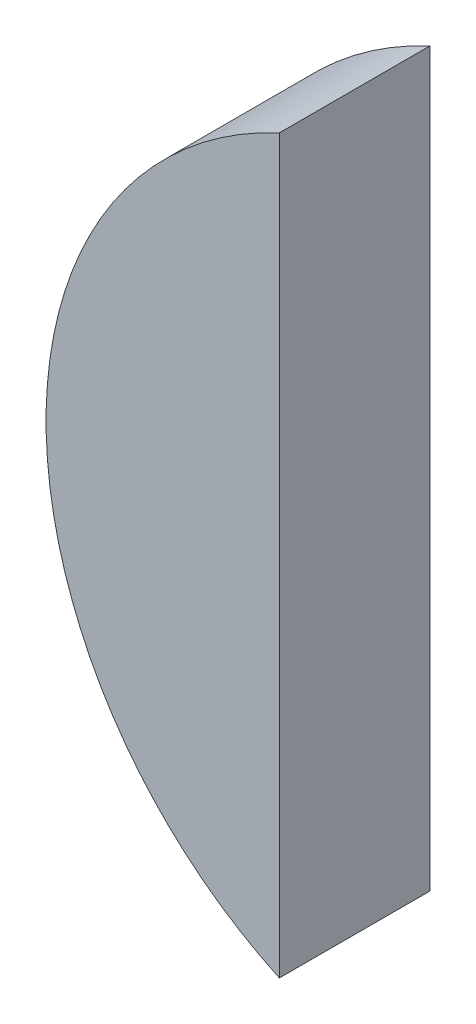
ISO-10303-21;
HEADER;
FILE_DESCRIPTION(('STEP AP214'),'2;1');
FILE_NAME('part.step','',(''),(''),'','','');
FILE_SCHEMA(('AUTOMOTIVE_DESIGN { 1 0 10303 214 1 1 1 1 }'));
ENDSEC;
DATA;
#1=APPLICATION_CONTEXT('core data for automotive mechanical design processes');
#2=APPLICATION_PROTOCOL_DEFINITION('international standard','automotive_design',2000,#1);
#3=PRODUCT_CONTEXT('',#1,'mechanical');
#4=PRODUCT('Part','Part','',(#3));
#5=PRODUCT_RELATED_PRODUCT_CATEGORY('part','',(#4));
#6=PRODUCT_DEFINITION_FORMATION('','',#4);
#7=PRODUCT_DEFINITION_CONTEXT('part definition',#1,'design');
#8=PRODUCT_DEFINITION('design','',#6,#7);
#9=PRODUCT_DEFINITION_SHAPE('','',#8);
#10=(LENGTH_UNIT() NAMED_UNIT(*) SI_UNIT(.MILLI.,.METRE.));
#11=(NAMED_UNIT(*) PLANE_ANGLE_UNIT() SI_UNIT($,.RADIAN.));
#12=(NAMED_UNIT(*) SI_UNIT($,.STERADIAN.) SOLID_ANGLE_UNIT());
#13=UNCERTAINTY_MEASURE_WITH_UNIT(LENGTH_MEASURE(1.E-05),#10,'distance_accuracy_value','');
#14=(GEOMETRIC_REPRESENTATION_CONTEXT(3) GLOBAL_UNCERTAINTY_ASSIGNED_CONTEXT((#13)) GLOBAL_UNIT_ASSIGNED_CONTEXT((#10,
#11,#12)) REPRESENTATION_CONTEXT('',''));
#15=CARTESIAN_POINT('',(0.,0.,0.));
#16=DIRECTION('',(0.,0.,1.));
#17=DIRECTION('',(1.,0.,0.));
#18=AXIS2_PLACEMENT_3D('',#15,#16,#17);
#19=CARTESIAN_POINT('',(-21.59,46.3483468102154,9.525));
#20=DIRECTION('',(1.,0.,0.));
#21=DIRECTION('',(0.,0.,-1.));
#22=AXIS2_PLACEMENT_3D('',#19,#20,#21);
#23=PLANE('',#22);
#24=DIRECTION('',(0.,-1.,0.));
#25=VECTOR('',#24,1.);
#26=CARTESIAN_POINT('',(-21.59,46.3483468102154,-9.525));
#27=LINE('',#26,#25);
#28=CARTESIAN_POINT('',(-21.59,46.3483468102153,-9.525));
#29=VERTEX_POINT('',#28);
#30=CARTESIAN_POINT('',(-21.59,-46.3483468102153,-9.525));
#31=VERTEX_POINT('',#30);
#32=EDGE_CURVE('E71',#29,#31,#27,.T.);
#33=ORIENTED_EDGE('',*,*,#32,.F.);
#34=DIRECTION('',(0.,0.,-1.));
#35=VECTOR('',#34,1.);
#36=CARTESIAN_POINT('',(-21.59,46.3483468102153,9.525));
#37=LINE('',#36,#35);
#38=CARTESIAN_POINT('',(-21.59,46.3483468102153,9.525));
#39=VERTEX_POINT('',#38);
#40=EDGE_CURVE('E11',#39,#29,#37,.T.);
#41=ORIENTED_EDGE('',*,*,#40,.F.);
#42=DIRECTION('',(0.,-1.,0.));
#43=VECTOR('',#42,1.);
#44=CARTESIAN_POINT('',(-21.59,46.3483468102154,9.525));
#45=LINE('',#44,#43);
#46=CARTESIAN_POINT('',(-21.59,-46.3483468102153,9.525));
#47=VERTEX_POINT('',#46);
#48=EDGE_CURVE('E72',#39,#47,#45,.T.);
#49=ORIENTED_EDGE('',*,*,#48,.T.);
#50=DIRECTION('',(0.,0.,-1.));
#51=VECTOR('',#50,1.);
#52=CARTESIAN_POINT('',(-21.59,-46.3483468102153,9.525));
#53=LINE('',#52,#51);
#54=EDGE_CURVE('E43',#47,#31,#53,.T.);
#55=ORIENTED_EDGE('',*,*,#54,.T.);
#56=EDGE_LOOP('',(#33,#41,#49,#55));
#57=FACE_BOUND('',#56,.T.);
#58=ADVANCED_FACE('F40',(#57),#23,.T.);
#59=CARTESIAN_POINT('',(0.,0.,9.525));
#60=DIRECTION('',(0.,0.,-1.));
#61=DIRECTION('',(-1.,0.,0.));
#62=AXIS2_PLACEMENT_3D('',#59,#60,#61);
#63=CYLINDRICAL_SURFACE('',#62,51.1302);
#64=CARTESIAN_POINT('',(0.,0.,-9.525));
#65=DIRECTION('',(0.,0.,1.));
#66=DIRECTION('',(1.,0.,0.));
#67=AXIS2_PLACEMENT_3D('',#64,#65,#66);
#68=CIRCLE('',#67,51.1302);
#69=EDGE_CURVE('E65',#29,#31,#68,.T.);
#70=ORIENTED_EDGE('',*,*,#69,.T.);
#71=ORIENTED_EDGE('',*,*,#54,.F.);
#72=CARTESIAN_POINT('',(0.,0.,9.525));
#73=DIRECTION('',(0.,0.,1.));
#74=DIRECTION('',(1.,0.,0.));
#75=AXIS2_PLACEMENT_3D('',#72,#73,#74);
#76=CIRCLE('',#75,51.1302);
#77=EDGE_CURVE('E67',#39,#47,#76,.T.);
#78=ORIENTED_EDGE('',*,*,#77,.F.);
#79=ORIENTED_EDGE('',*,*,#40,.T.);
#80=EDGE_LOOP('',(#70,#71,#78,#79));
#81=FACE_BOUND('',#80,.T.);
#82=ADVANCED_FACE('F64',(#81),#63,.T.);
#83=CARTESIAN_POINT('',(0.,0.,9.525));
#84=DIRECTION('',(0.,0.,1.));
#85=DIRECTION('',(1.,0.,0.));
#86=AXIS2_PLACEMENT_3D('',#83,#84,#85);
#87=PLANE('',#86);
#88=ORIENTED_EDGE('',*,*,#48,.F.);
#89=ORIENTED_EDGE('',*,*,#77,.T.);
#90=EDGE_LOOP('',(#88,#89));
#91=FACE_BOUND('',#90,.T.);
#92=ADVANCED_FACE('F78',(#91),#87,.T.);
#93=CARTESIAN_POINT('',(0.,0.,-9.525));
#94=DIRECTION('',(0.,0.,1.));
#95=DIRECTION('',(1.,0.,0.));
#96=AXIS2_PLACEMENT_3D('',#93,#94,#95);
#97=PLANE('',#96);
#98=ORIENTED_EDGE('',*,*,#32,.T.);
#99=ORIENTED_EDGE('',*,*,#69,.F.);
#100=EDGE_LOOP('',(#98,#99));
#101=FACE_BOUND('',#100,.T.);
#102=ADVANCED_FACE('F70',(#101),#97,.F.);
#103=CLOSED_SHELL('',(#58,#82,#92,#102));
#104=MANIFOLD_SOLID_BREP('B2',#103);
#105=ADVANCED_BREP_SHAPE_REPRESENTATION('',(#18,#104),#14);
#106=SHAPE_DEFINITION_REPRESENTATION(#9,#105);
ENDSEC;
END-ISO-10303-21;
